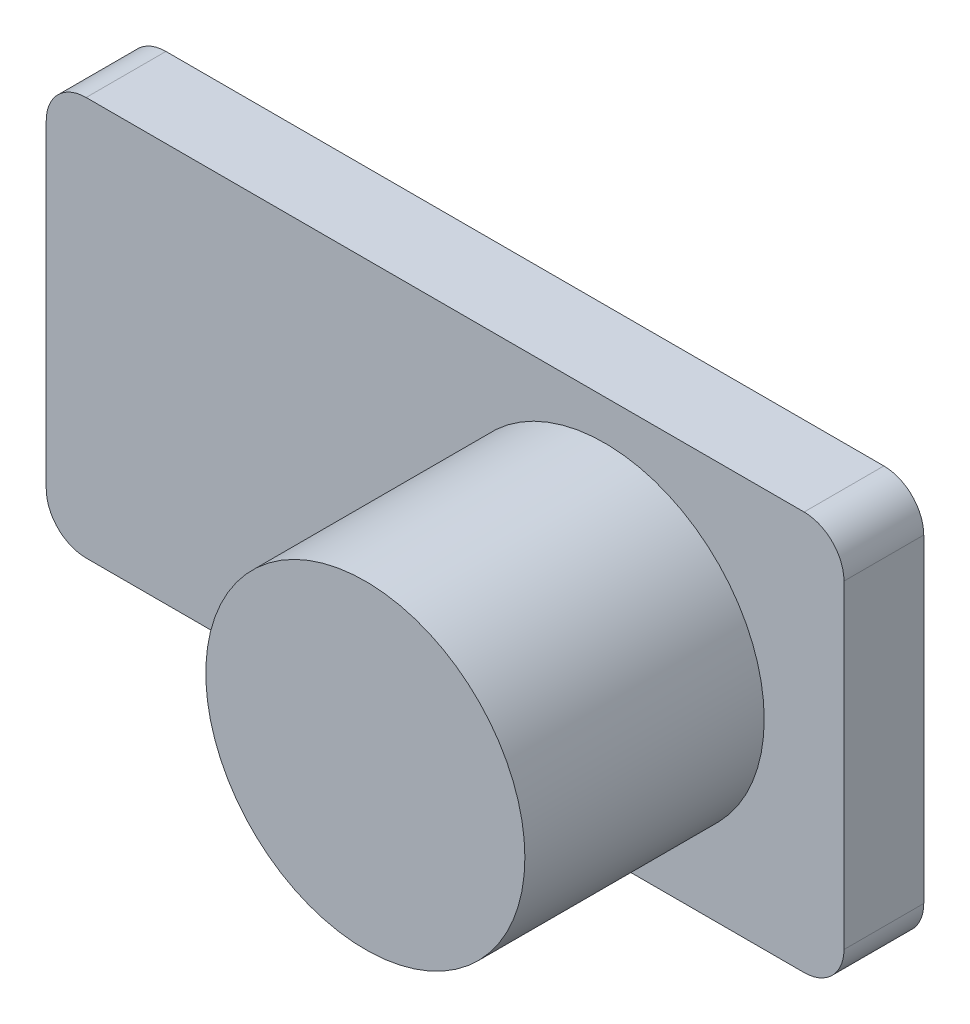
ISO-10303-21;
HEADER;
FILE_DESCRIPTION(('STEP AP214'),'2;1');
FILE_NAME('part.step','',(''),(''),'','','');
FILE_SCHEMA(('AUTOMOTIVE_DESIGN { 1 0 10303 214 1 1 1 1 }'));
ENDSEC;
DATA;
#1=APPLICATION_CONTEXT('core data for automotive mechanical design processes');
#2=APPLICATION_PROTOCOL_DEFINITION('international standard','automotive_design',2000,#1);
#3=PRODUCT_CONTEXT('',#1,'mechanical');
#4=PRODUCT('Part','Part','',(#3));
#5=PRODUCT_RELATED_PRODUCT_CATEGORY('part','',(#4));
#6=PRODUCT_DEFINITION_FORMATION('','',#4);
#7=PRODUCT_DEFINITION_CONTEXT('part definition',#1,'design');
#8=PRODUCT_DEFINITION('design','',#6,#7);
#9=PRODUCT_DEFINITION_SHAPE('','',#8);
#10=(LENGTH_UNIT() NAMED_UNIT(*) SI_UNIT(.MILLI.,.METRE.));
#11=(NAMED_UNIT(*) PLANE_ANGLE_UNIT() SI_UNIT($,.RADIAN.));
#12=(NAMED_UNIT(*) SI_UNIT($,.STERADIAN.) SOLID_ANGLE_UNIT());
#13=UNCERTAINTY_MEASURE_WITH_UNIT(LENGTH_MEASURE(1.E-05),#10,'distance_accuracy_value','');
#14=(GEOMETRIC_REPRESENTATION_CONTEXT(3) GLOBAL_UNCERTAINTY_ASSIGNED_CONTEXT((#13)) GLOBAL_UNIT_ASSIGNED_CONTEXT((#10,
#11,#12)) REPRESENTATION_CONTEXT('',''));
#15=CARTESIAN_POINT('',(0.,0.,0.));
#16=DIRECTION('',(0.,0.,1.));
#17=DIRECTION('',(1.,0.,0.));
#18=AXIS2_PLACEMENT_3D('',#15,#16,#17);
#19=CARTESIAN_POINT('',(-10.,-22.096458497182,2.));
#20=DIRECTION('',(1.,0.,0.));
#21=DIRECTION('',(0.,1.,0.));
#22=AXIS2_PLACEMENT_3D('',#19,#20,#21);
#23=PLANE('',#22);
#24=DIRECTION('',(0.,-1.,0.));
#25=VECTOR('',#24,1.);
#26=CARTESIAN_POINT('',(-10.,-22.096458497182,0.));
#27=LINE('',#26,#25);
#28=CARTESIAN_POINT('',(-10.,-23.096458497182,0.));
#29=VERTEX_POINT('',#28);
#30=CARTESIAN_POINT('',(-10.,-31.096458497182,0.));
#31=VERTEX_POINT('',#30);
#32=EDGE_CURVE('E128',#29,#31,#27,.T.);
#33=ORIENTED_EDGE('',*,*,#32,.T.);
#34=DIRECTION('',(0.,0.,-1.));
#35=VECTOR('',#34,1.);
#36=CARTESIAN_POINT('',(-10.,-31.096458497182,2.));
#37=LINE('',#36,#35);
#38=CARTESIAN_POINT('',(-10.,-31.096458497182,2.));
#39=VERTEX_POINT('',#38);
#40=EDGE_CURVE('E105',#31,#39,#37,.F.);
#41=ORIENTED_EDGE('',*,*,#40,.T.);
#42=DIRECTION('',(0.,-1.,0.));
#43=VECTOR('',#42,1.);
#44=CARTESIAN_POINT('',(-10.,-22.096458497182,2.));
#45=LINE('',#44,#43);
#46=CARTESIAN_POINT('',(-10.,-23.096458497182,2.));
#47=VERTEX_POINT('',#46);
#48=EDGE_CURVE('E138',#47,#39,#45,.T.);
#49=ORIENTED_EDGE('',*,*,#48,.F.);
#50=DIRECTION('',(0.,0.,-1.));
#51=VECTOR('',#50,1.);
#52=CARTESIAN_POINT('',(-10.,-23.096458497182,2.));
#53=LINE('',#52,#51);
#54=EDGE_CURVE('E110',#47,#29,#53,.T.);
#55=ORIENTED_EDGE('',*,*,#54,.T.);
#56=EDGE_LOOP('',(#33,#41,#49,#55));
#57=FACE_BOUND('',#56,.T.);
#58=ADVANCED_FACE('F33',(#57),#23,.F.);
#59=CARTESIAN_POINT('',(-10.,-32.096458497182,2.));
#60=DIRECTION('',(0.,1.,0.));
#61=DIRECTION('',(0.,0.,1.));
#62=AXIS2_PLACEMENT_3D('',#59,#60,#61);
#63=PLANE('',#62);
#64=DIRECTION('',(1.,0.,0.));
#65=VECTOR('',#64,1.);
#66=CARTESIAN_POINT('',(-10.,-32.096458497182,2.));
#67=LINE('',#66,#65);
#68=CARTESIAN_POINT('',(-9.,-32.096458497182,2.));
#69=VERTEX_POINT('',#68);
#70=CARTESIAN_POINT('',(9.00000000000001,-32.096458497182,2.));
#71=VERTEX_POINT('',#70);
#72=EDGE_CURVE('E120',#69,#71,#67,.T.);
#73=ORIENTED_EDGE('',*,*,#72,.F.);
#74=DIRECTION('',(0.,0.,-1.));
#75=VECTOR('',#74,1.);
#76=CARTESIAN_POINT('',(-9.,-32.096458497182,2.));
#77=LINE('',#76,#75);
#78=CARTESIAN_POINT('',(-9.,-32.096458497182,0.));
#79=VERTEX_POINT('',#78);
#80=EDGE_CURVE('E104',#69,#79,#77,.T.);
#81=ORIENTED_EDGE('',*,*,#80,.T.);
#82=DIRECTION('',(1.,0.,0.));
#83=VECTOR('',#82,1.);
#84=CARTESIAN_POINT('',(-10.,-32.096458497182,0.));
#85=LINE('',#84,#83);
#86=CARTESIAN_POINT('',(9.00000000000001,-32.096458497182,0.));
#87=VERTEX_POINT('',#86);
#88=EDGE_CURVE('E117',#79,#87,#85,.T.);
#89=ORIENTED_EDGE('',*,*,#88,.T.);
#90=DIRECTION('',(0.,0.,-1.));
#91=VECTOR('',#90,1.);
#92=CARTESIAN_POINT('',(9.00000000000001,-32.096458497182,2.));
#93=LINE('',#92,#91);
#94=EDGE_CURVE('E122',#87,#71,#93,.F.);
#95=ORIENTED_EDGE('',*,*,#94,.T.);
#96=EDGE_LOOP('',(#73,#81,#89,#95));
#97=FACE_BOUND('',#96,.T.);
#98=ADVANCED_FACE('F116',(#97),#63,.F.);
#99=CARTESIAN_POINT('',(10.,-22.096458497182,2.));
#100=DIRECTION('',(-1.,0.,0.));
#101=DIRECTION('',(0.,-1.,0.));
#102=AXIS2_PLACEMENT_3D('',#99,#100,#101);
#103=PLANE('',#102);
#104=DIRECTION('',(0.,1.,0.));
#105=VECTOR('',#104,1.);
#106=CARTESIAN_POINT('',(10.,-22.096458497182,2.));
#107=LINE('',#106,#105);
#108=CARTESIAN_POINT('',(10.,-31.096458497182,2.));
#109=VERTEX_POINT('',#108);
#110=CARTESIAN_POINT('',(10.,-23.096458497182,2.));
#111=VERTEX_POINT('',#110);
#112=EDGE_CURVE('E161',#109,#111,#107,.T.);
#113=ORIENTED_EDGE('',*,*,#112,.F.);
#114=DIRECTION('',(0.,0.,-1.));
#115=VECTOR('',#114,1.);
#116=CARTESIAN_POINT('',(10.,-31.096458497182,2.));
#117=LINE('',#116,#115);
#118=CARTESIAN_POINT('',(10.,-31.096458497182,0.));
#119=VERTEX_POINT('',#118);
#120=EDGE_CURVE('E11',#109,#119,#117,.T.);
#121=ORIENTED_EDGE('',*,*,#120,.T.);
#122=DIRECTION('',(0.,1.,0.));
#123=VECTOR('',#122,1.);
#124=CARTESIAN_POINT('',(10.,-22.096458497182,0.));
#125=LINE('',#124,#123);
#126=CARTESIAN_POINT('',(10.,-23.096458497182,0.));
#127=VERTEX_POINT('',#126);
#128=EDGE_CURVE('E127',#119,#127,#125,.T.);
#129=ORIENTED_EDGE('',*,*,#128,.T.);
#130=DIRECTION('',(0.,0.,-1.));
#131=VECTOR('',#130,1.);
#132=CARTESIAN_POINT('',(10.,-23.096458497182,2.));
#133=LINE('',#132,#131);
#134=EDGE_CURVE('E41',#127,#111,#133,.F.);
#135=ORIENTED_EDGE('',*,*,#134,.T.);
#136=EDGE_LOOP('',(#113,#121,#129,#135));
#137=FACE_BOUND('',#136,.T.);
#138=ADVANCED_FACE('F160',(#137),#103,.F.);
#139=CARTESIAN_POINT('',(-10.,-22.096458497182,2.));
#140=DIRECTION('',(0.,-1.,0.));
#141=DIRECTION('',(0.,0.,-1.));
#142=AXIS2_PLACEMENT_3D('',#139,#140,#141);
#143=PLANE('',#142);
#144=DIRECTION('',(-1.,0.,0.));
#145=VECTOR('',#144,1.);
#146=CARTESIAN_POINT('',(-10.,-22.096458497182,0.));
#147=LINE('',#146,#145);
#148=CARTESIAN_POINT('',(9.,-22.096458497182,0.));
#149=VERTEX_POINT('',#148);
#150=CARTESIAN_POINT('',(-9.,-22.096458497182,0.));
#151=VERTEX_POINT('',#150);
#152=EDGE_CURVE('E131',#149,#151,#147,.T.);
#153=ORIENTED_EDGE('',*,*,#152,.T.);
#154=DIRECTION('',(0.,0.,-1.));
#155=VECTOR('',#154,1.);
#156=CARTESIAN_POINT('',(-9.,-22.096458497182,2.));
#157=LINE('',#156,#155);
#158=CARTESIAN_POINT('',(-9.,-22.096458497182,2.));
#159=VERTEX_POINT('',#158);
#160=EDGE_CURVE('E48',#151,#159,#157,.F.);
#161=ORIENTED_EDGE('',*,*,#160,.T.);
#162=DIRECTION('',(-1.,0.,0.));
#163=VECTOR('',#162,1.);
#164=CARTESIAN_POINT('',(-10.,-22.096458497182,2.));
#165=LINE('',#164,#163);
#166=CARTESIAN_POINT('',(9.,-22.096458497182,2.));
#167=VERTEX_POINT('',#166);
#168=EDGE_CURVE('E167',#167,#159,#165,.T.);
#169=ORIENTED_EDGE('',*,*,#168,.F.);
#170=DIRECTION('',(0.,0.,-1.));
#171=VECTOR('',#170,1.);
#172=CARTESIAN_POINT('',(9.,-22.096458497182,2.));
#173=LINE('',#172,#171);
#174=EDGE_CURVE('E154',#167,#149,#173,.T.);
#175=ORIENTED_EDGE('',*,*,#174,.T.);
#176=EDGE_LOOP('',(#153,#161,#169,#175));
#177=FACE_BOUND('',#176,.T.);
#178=ADVANCED_FACE('F171',(#177),#143,.F.);
#179=CARTESIAN_POINT('',(0.,0.,2.));
#180=DIRECTION('',(0.,0.,1.));
#181=DIRECTION('',(1.,0.,0.));
#182=AXIS2_PLACEMENT_3D('',#179,#180,#181);
#183=PLANE('',#182);
#184=CARTESIAN_POINT('',(4.,-27.096458497182,2.));
#185=DIRECTION('',(0.,0.,1.));
#186=DIRECTION('',(1.,0.,0.));
#187=AXIS2_PLACEMENT_3D('',#184,#185,#186);
#188=CIRCLE('',#187,4.);
#189=CARTESIAN_POINT('',(8.,-27.096458497182,2.));
#190=VERTEX_POINT('',#189);
#191=EDGE_CURVE('E139',#190,#190,#188,.T.);
#192=ORIENTED_EDGE('',*,*,#191,.F.);
#193=EDGE_LOOP('',(#192));
#194=FACE_BOUND('',#193,.T.);
#195=ORIENTED_EDGE('',*,*,#48,.T.);
#196=CARTESIAN_POINT('',(-9.,-31.096458497182,2.));
#197=DIRECTION('',(0.,0.,1.));
#198=DIRECTION('',(1.,0.,0.));
#199=AXIS2_PLACEMENT_3D('',#196,#197,#198);
#200=CIRCLE('',#199,1.);
#201=EDGE_CURVE('E152',#39,#69,#200,.T.);
#202=ORIENTED_EDGE('',*,*,#201,.T.);
#203=ORIENTED_EDGE('',*,*,#72,.T.);
#204=CARTESIAN_POINT('',(9.,-31.096458497182,2.));
#205=DIRECTION('',(0.,0.,1.));
#206=DIRECTION('',(1.,0.,0.));
#207=AXIS2_PLACEMENT_3D('',#204,#205,#206);
#208=CIRCLE('',#207,1.);
#209=EDGE_CURVE('E148',#71,#109,#208,.T.);
#210=ORIENTED_EDGE('',*,*,#209,.T.);
#211=ORIENTED_EDGE('',*,*,#112,.T.);
#212=CARTESIAN_POINT('',(9.,-23.096458497182,2.));
#213=DIRECTION('',(0.,0.,1.));
#214=DIRECTION('',(1.,0.,0.));
#215=AXIS2_PLACEMENT_3D('',#212,#213,#214);
#216=CIRCLE('',#215,1.);
#217=EDGE_CURVE('E55',#111,#167,#216,.T.);
#218=ORIENTED_EDGE('',*,*,#217,.T.);
#219=ORIENTED_EDGE('',*,*,#168,.T.);
#220=CARTESIAN_POINT('',(-9.,-23.096458497182,2.));
#221=DIRECTION('',(0.,0.,1.));
#222=DIRECTION('',(1.,0.,0.));
#223=AXIS2_PLACEMENT_3D('',#220,#221,#222);
#224=CIRCLE('',#223,1.);
#225=EDGE_CURVE('E150',#159,#47,#224,.T.);
#226=ORIENTED_EDGE('',*,*,#225,.T.);
#227=EDGE_LOOP('',(#195,#202,#203,#210,#211,#218,#219,#226));
#228=FACE_BOUND('',#227,.T.);
#229=ADVANCED_FACE('F165',(#194,#228),#183,.T.);
#230=CARTESIAN_POINT('',(0.,0.,0.));
#231=DIRECTION('',(0.,0.,1.));
#232=DIRECTION('',(1.,0.,0.));
#233=AXIS2_PLACEMENT_3D('',#230,#231,#232);
#234=PLANE('',#233);
#235=ORIENTED_EDGE('',*,*,#88,.F.);
#236=CARTESIAN_POINT('',(-9.,-31.096458497182,0.));
#237=DIRECTION('',(0.,0.,1.));
#238=DIRECTION('',(1.,0.,0.));
#239=AXIS2_PLACEMENT_3D('',#236,#237,#238);
#240=CIRCLE('',#239,1.);
#241=EDGE_CURVE('E100',#79,#31,#240,.F.);
#242=ORIENTED_EDGE('',*,*,#241,.T.);
#243=ORIENTED_EDGE('',*,*,#32,.F.);
#244=CARTESIAN_POINT('',(-9.,-23.096458497182,0.));
#245=DIRECTION('',(0.,0.,1.));
#246=DIRECTION('',(1.,0.,0.));
#247=AXIS2_PLACEMENT_3D('',#244,#245,#246);
#248=CIRCLE('',#247,1.);
#249=EDGE_CURVE('E111',#29,#151,#248,.F.);
#250=ORIENTED_EDGE('',*,*,#249,.T.);
#251=ORIENTED_EDGE('',*,*,#152,.F.);
#252=CARTESIAN_POINT('',(9.,-23.096458497182,0.));
#253=DIRECTION('',(0.,0.,1.));
#254=DIRECTION('',(1.,0.,0.));
#255=AXIS2_PLACEMENT_3D('',#252,#253,#254);
#256=CIRCLE('',#255,1.);
#257=EDGE_CURVE('E121',#149,#127,#256,.F.);
#258=ORIENTED_EDGE('',*,*,#257,.T.);
#259=ORIENTED_EDGE('',*,*,#128,.F.);
#260=CARTESIAN_POINT('',(9.,-31.096458497182,0.));
#261=DIRECTION('',(0.,0.,1.));
#262=DIRECTION('',(1.,0.,0.));
#263=AXIS2_PLACEMENT_3D('',#260,#261,#262);
#264=CIRCLE('',#263,1.);
#265=EDGE_CURVE('E126',#119,#87,#264,.F.);
#266=ORIENTED_EDGE('',*,*,#265,.T.);
#267=EDGE_LOOP('',(#235,#242,#243,#250,#251,#258,#259,#266));
#268=FACE_BOUND('',#267,.T.);
#269=ADVANCED_FACE('F124',(#268),#234,.F.);
#270=CARTESIAN_POINT('',(4.,-27.096458497182,8.));
#271=DIRECTION('',(0.,0.,-1.));
#272=DIRECTION('',(-1.,0.,0.));
#273=AXIS2_PLACEMENT_3D('',#270,#271,#272);
#274=CYLINDRICAL_SURFACE('',#273,4.);
#275=CARTESIAN_POINT('',(4.,-27.096458497182,8.));
#276=DIRECTION('',(0.,0.,1.));
#277=DIRECTION('',(1.,0.,0.));
#278=AXIS2_PLACEMENT_3D('',#275,#276,#277);
#279=CIRCLE('',#278,4.);
#280=CARTESIAN_POINT('',(8.,-27.096458497182,8.));
#281=VERTEX_POINT('',#280);
#282=EDGE_CURVE('E133',#281,#281,#279,.T.);
#283=ORIENTED_EDGE('',*,*,#282,.F.);
#284=EDGE_LOOP('',(#283));
#285=FACE_BOUND('',#284,.T.);
#286=ORIENTED_EDGE('',*,*,#191,.T.);
#287=EDGE_LOOP('',(#286));
#288=FACE_BOUND('',#287,.T.);
#289=ADVANCED_FACE('F185',(#285,#288),#274,.T.);
#290=CARTESIAN_POINT('',(4.,-27.096458497182,8.));
#291=DIRECTION('',(0.,0.,1.));
#292=DIRECTION('',(1.,0.,0.));
#293=AXIS2_PLACEMENT_3D('',#290,#291,#292);
#294=PLANE('',#293);
#295=ORIENTED_EDGE('',*,*,#282,.T.);
#296=EDGE_LOOP('',(#295));
#297=FACE_BOUND('',#296,.T.);
#298=ADVANCED_FACE('F206',(#297),#294,.T.);
#299=CARTESIAN_POINT('',(-9.,-31.096458497182,2.));
#300=DIRECTION('',(0.,0.,-1.));
#301=DIRECTION('',(-1.,0.,0.));
#302=AXIS2_PLACEMENT_3D('',#299,#300,#301);
#303=CYLINDRICAL_SURFACE('',#302,1.);
#304=ORIENTED_EDGE('',*,*,#201,.F.);
#305=ORIENTED_EDGE('',*,*,#40,.F.);
#306=ORIENTED_EDGE('',*,*,#241,.F.);
#307=ORIENTED_EDGE('',*,*,#80,.F.);
#308=EDGE_LOOP('',(#304,#305,#306,#307));
#309=FACE_BOUND('',#308,.T.);
#310=ADVANCED_FACE('F103',(#309),#303,.T.);
#311=CARTESIAN_POINT('',(-9.,-23.096458497182,2.));
#312=DIRECTION('',(0.,0.,-1.));
#313=DIRECTION('',(-1.,0.,0.));
#314=AXIS2_PLACEMENT_3D('',#311,#312,#313);
#315=CYLINDRICAL_SURFACE('',#314,1.);
#316=ORIENTED_EDGE('',*,*,#225,.F.);
#317=ORIENTED_EDGE('',*,*,#160,.F.);
#318=ORIENTED_EDGE('',*,*,#249,.F.);
#319=ORIENTED_EDGE('',*,*,#54,.F.);
#320=EDGE_LOOP('',(#316,#317,#318,#319));
#321=FACE_BOUND('',#320,.T.);
#322=ADVANCED_FACE('F175',(#321),#315,.T.);
#323=CARTESIAN_POINT('',(9.,-31.096458497182,2.));
#324=DIRECTION('',(0.,0.,-1.));
#325=DIRECTION('',(-1.,0.,0.));
#326=AXIS2_PLACEMENT_3D('',#323,#324,#325);
#327=CYLINDRICAL_SURFACE('',#326,1.);
#328=ORIENTED_EDGE('',*,*,#209,.F.);
#329=ORIENTED_EDGE('',*,*,#94,.F.);
#330=ORIENTED_EDGE('',*,*,#265,.F.);
#331=ORIENTED_EDGE('',*,*,#120,.F.);
#332=EDGE_LOOP('',(#328,#329,#330,#331));
#333=FACE_BOUND('',#332,.T.);
#334=ADVANCED_FACE('F208',(#333),#327,.T.);
#335=CARTESIAN_POINT('',(9.,-23.096458497182,2.));
#336=DIRECTION('',(0.,0.,-1.));
#337=DIRECTION('',(-1.,0.,0.));
#338=AXIS2_PLACEMENT_3D('',#335,#336,#337);
#339=CYLINDRICAL_SURFACE('',#338,1.);
#340=ORIENTED_EDGE('',*,*,#217,.F.);
#341=ORIENTED_EDGE('',*,*,#134,.F.);
#342=ORIENTED_EDGE('',*,*,#257,.F.);
#343=ORIENTED_EDGE('',*,*,#174,.F.);
#344=EDGE_LOOP('',(#340,#341,#342,#343));
#345=FACE_BOUND('',#344,.T.);
#346=ADVANCED_FACE('F35',(#345),#339,.T.);
#347=CLOSED_SHELL('',(#58,#98,#138,#178,#229,#269,#289,#298,#310,#322,#334,#346));
#348=MANIFOLD_SOLID_BREP('B2',#347);
#349=ADVANCED_BREP_SHAPE_REPRESENTATION('',(#18,#348),#14);
#350=SHAPE_DEFINITION_REPRESENTATION(#9,#349);
ENDSEC;
END-ISO-10303-21;
